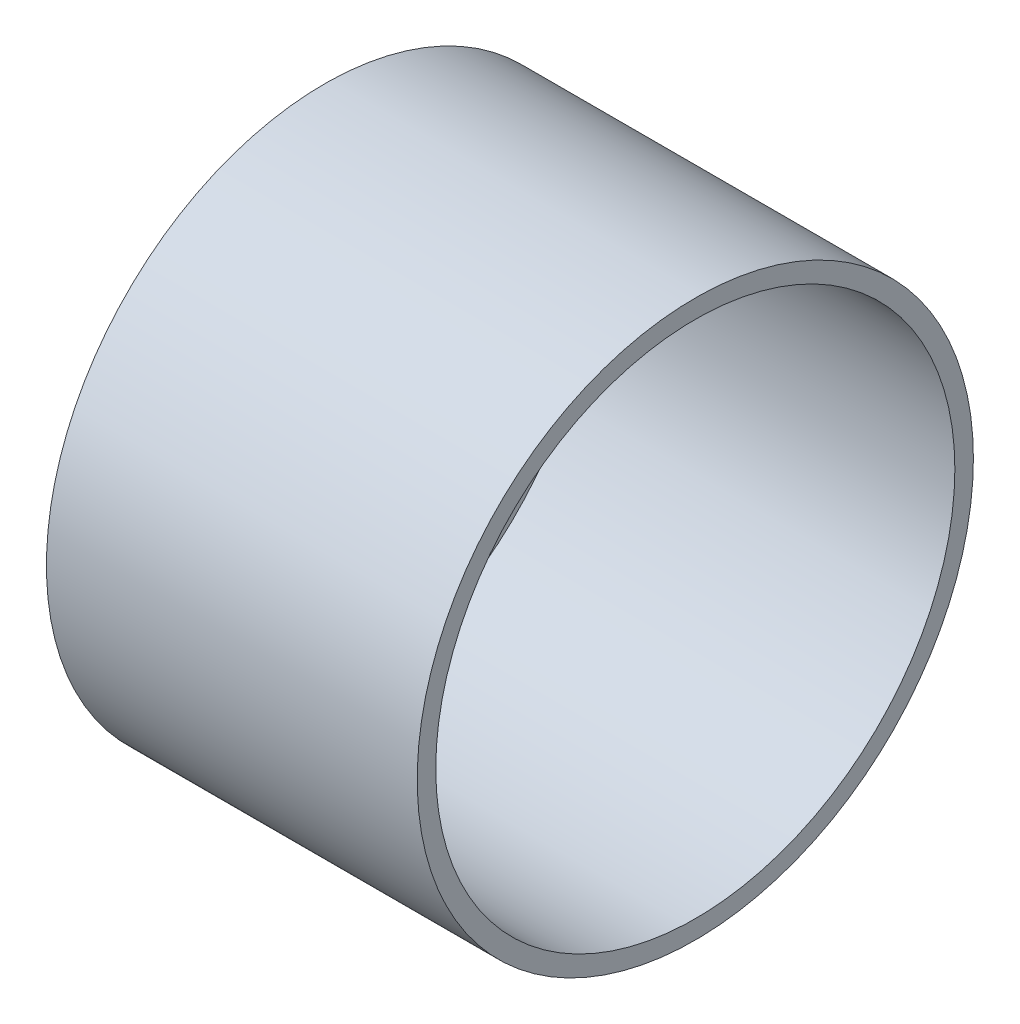
ISO-10303-21;
HEADER;
FILE_DESCRIPTION(('STEP AP214'),'2;1');
FILE_NAME('part.step','',(''),(''),'','','');
FILE_SCHEMA(('AUTOMOTIVE_DESIGN { 1 0 10303 214 1 1 1 1 }'));
ENDSEC;
DATA;
#1=APPLICATION_CONTEXT('core data for automotive mechanical design processes');
#2=APPLICATION_PROTOCOL_DEFINITION('international standard','automotive_design',2000,#1);
#3=PRODUCT_CONTEXT('',#1,'mechanical');
#4=PRODUCT('Part','Part','',(#3));
#5=PRODUCT_RELATED_PRODUCT_CATEGORY('part','',(#4));
#6=PRODUCT_DEFINITION_FORMATION('','',#4);
#7=PRODUCT_DEFINITION_CONTEXT('part definition',#1,'design');
#8=PRODUCT_DEFINITION('design','',#6,#7);
#9=PRODUCT_DEFINITION_SHAPE('','',#8);
#10=(LENGTH_UNIT() NAMED_UNIT(*) SI_UNIT(.MILLI.,.METRE.));
#11=(NAMED_UNIT(*) PLANE_ANGLE_UNIT() SI_UNIT($,.RADIAN.));
#12=(NAMED_UNIT(*) SI_UNIT($,.STERADIAN.) SOLID_ANGLE_UNIT());
#13=UNCERTAINTY_MEASURE_WITH_UNIT(LENGTH_MEASURE(1.E-05),#10,'distance_accuracy_value','');
#14=(GEOMETRIC_REPRESENTATION_CONTEXT(3) GLOBAL_UNCERTAINTY_ASSIGNED_CONTEXT((#13)) GLOBAL_UNIT_ASSIGNED_CONTEXT((#10,
#11,#12)) REPRESENTATION_CONTEXT('',''));
#15=CARTESIAN_POINT('',(0.,0.,0.));
#16=DIRECTION('',(0.,0.,1.));
#17=DIRECTION('',(1.,0.,0.));
#18=AXIS2_PLACEMENT_3D('',#15,#16,#17);
#19=CARTESIAN_POINT('',(1.99999999999999,0.,0.));
#20=DIRECTION('',(1.,0.,0.));
#21=DIRECTION('',(0.,0.,-1.));
#22=AXIS2_PLACEMENT_3D('',#19,#20,#21);
#23=PLANE('',#22);
#24=CARTESIAN_POINT('',(1.99999999999999,0.,0.));
#25=DIRECTION('',(1.,0.,0.));
#26=DIRECTION('',(0.,0.,-1.));
#27=AXIS2_PLACEMENT_3D('',#24,#25,#26);
#28=CIRCLE('',#27,6.);
#29=CARTESIAN_POINT('',(1.99999999999999,0.,-6.));
#30=VERTEX_POINT('',#29);
#31=EDGE_CURVE('E92',#30,#30,#28,.T.);
#32=ORIENTED_EDGE('',*,*,#31,.F.);
#33=EDGE_LOOP('',(#32));
#34=FACE_BOUND('',#33,.T.);
#35=CARTESIAN_POINT('',(1.99999999999999,15.,0.));
#36=DIRECTION('',(1.,0.,0.));
#37=DIRECTION('',(0.,0.,-1.));
#38=AXIS2_PLACEMENT_3D('',#35,#36,#37);
#39=CIRCLE('',#38,1.8);
#40=CARTESIAN_POINT('',(1.99999999999999,15.,-1.8));
#41=VERTEX_POINT('',#40);
#42=EDGE_CURVE('E84',#41,#41,#39,.T.);
#43=ORIENTED_EDGE('',*,*,#42,.F.);
#44=EDGE_LOOP('',(#43));
#45=FACE_BOUND('',#44,.T.);
#46=CARTESIAN_POINT('',(1.99999999999999,-7.50000000000006,12.9903810567665));
#47=DIRECTION('',(1.,0.,0.));
#48=DIRECTION('',(0.,0.,-1.));
#49=AXIS2_PLACEMENT_3D('',#46,#47,#48);
#50=CIRCLE('',#49,1.8);
#51=CARTESIAN_POINT('',(1.99999999999999,-7.50000000000006,11.1903810567665));
#52=VERTEX_POINT('',#51);
#53=EDGE_CURVE('E76',#52,#52,#50,.T.);
#54=ORIENTED_EDGE('',*,*,#53,.F.);
#55=EDGE_LOOP('',(#54));
#56=FACE_BOUND('',#55,.T.);
#57=CARTESIAN_POINT('',(1.99999999999999,-7.50000000000006,-12.9903810567665));
#58=DIRECTION('',(1.,0.,0.));
#59=DIRECTION('',(0.,0.,-1.));
#60=AXIS2_PLACEMENT_3D('',#57,#58,#59);
#61=CIRCLE('',#60,1.8);
#62=CARTESIAN_POINT('',(1.99999999999999,-7.50000000000006,-14.7903810567665));
#63=VERTEX_POINT('',#62);
#64=EDGE_CURVE('E68',#63,#63,#61,.T.);
#65=ORIENTED_EDGE('',*,*,#64,.F.);
#66=EDGE_LOOP('',(#65));
#67=FACE_BOUND('',#66,.T.);
#68=CARTESIAN_POINT('',(1.99999999999999,0.,0.));
#69=DIRECTION('',(1.,0.,0.));
#70=DIRECTION('',(0.,0.,-1.));
#71=AXIS2_PLACEMENT_3D('',#68,#69,#70);
#72=CIRCLE('',#71,70.);
#73=CARTESIAN_POINT('',(1.99999999999999,0.,-70.));
#74=VERTEX_POINT('',#73);
#75=EDGE_CURVE('E10',#74,#74,#72,.F.);
#76=ORIENTED_EDGE('',*,*,#75,.F.);
#77=EDGE_LOOP('',(#76));
#78=FACE_BOUND('',#77,.T.);
#79=ADVANCED_FACE('F43',(#34,#45,#56,#67,#78),#23,.T.);
#80=CARTESIAN_POINT('',(100.,0.,0.));
#81=DIRECTION('',(1.,0.,0.));
#82=DIRECTION('',(0.,0.,-1.));
#83=AXIS2_PLACEMENT_3D('',#80,#81,#82);
#84=PLANE('',#83);
#85=CARTESIAN_POINT('',(100.,0.,0.));
#86=DIRECTION('',(1.,0.,0.));
#87=DIRECTION('',(0.,0.,-1.));
#88=AXIS2_PLACEMENT_3D('',#85,#86,#87);
#89=CIRCLE('',#88,75.);
#90=CARTESIAN_POINT('',(100.,0.,-75.));
#91=VERTEX_POINT('',#90);
#92=EDGE_CURVE('E51',#91,#91,#89,.T.);
#93=ORIENTED_EDGE('',*,*,#92,.T.);
#94=EDGE_LOOP('',(#93));
#95=FACE_BOUND('',#94,.T.);
#96=CARTESIAN_POINT('',(100.,0.,0.));
#97=DIRECTION('',(1.,0.,0.));
#98=DIRECTION('',(0.,0.,-1.));
#99=AXIS2_PLACEMENT_3D('',#96,#97,#98);
#100=CIRCLE('',#99,70.);
#101=CARTESIAN_POINT('',(100.,0.,-70.));
#102=VERTEX_POINT('',#101);
#103=EDGE_CURVE('E62',#102,#102,#100,.T.);
#104=ORIENTED_EDGE('',*,*,#103,.F.);
#105=EDGE_LOOP('',(#104));
#106=FACE_BOUND('',#105,.T.);
#107=ADVANCED_FACE('F117',(#95,#106),#84,.T.);
#108=CARTESIAN_POINT('',(100.,0.,0.));
#109=DIRECTION('',(-1.,0.,0.));
#110=DIRECTION('',(0.,0.,1.));
#111=AXIS2_PLACEMENT_3D('',#108,#109,#110);
#112=CYLINDRICAL_SURFACE('',#111,75.);
#113=ORIENTED_EDGE('',*,*,#92,.F.);
#114=EDGE_LOOP('',(#113));
#115=FACE_BOUND('',#114,.T.);
#116=CARTESIAN_POINT('',(0.,0.,0.));
#117=DIRECTION('',(1.,0.,0.));
#118=DIRECTION('',(0.,0.,-1.));
#119=AXIS2_PLACEMENT_3D('',#116,#117,#118);
#120=CIRCLE('',#119,75.);
#121=CARTESIAN_POINT('',(0.,0.,-75.));
#122=VERTEX_POINT('',#121);
#123=EDGE_CURVE('E56',#122,#122,#120,.T.);
#124=ORIENTED_EDGE('',*,*,#123,.T.);
#125=EDGE_LOOP('',(#124));
#126=FACE_BOUND('',#125,.T.);
#127=ADVANCED_FACE('F115',(#115,#126),#112,.T.);
#128=CARTESIAN_POINT('',(100.,0.,0.));
#129=DIRECTION('',(-1.,0.,0.));
#130=DIRECTION('',(0.,0.,1.));
#131=AXIS2_PLACEMENT_3D('',#128,#129,#130);
#132=CYLINDRICAL_SURFACE('',#131,70.);
#133=ORIENTED_EDGE('',*,*,#75,.T.);
#134=EDGE_LOOP('',(#133));
#135=FACE_BOUND('',#134,.T.);
#136=ORIENTED_EDGE('',*,*,#103,.T.);
#137=EDGE_LOOP('',(#136));
#138=FACE_BOUND('',#137,.T.);
#139=ADVANCED_FACE('F106',(#135,#138),#132,.F.);
#140=CARTESIAN_POINT('',(0.,0.,0.));
#141=DIRECTION('',(1.,0.,0.));
#142=DIRECTION('',(0.,0.,-1.));
#143=AXIS2_PLACEMENT_3D('',#140,#141,#142);
#144=PLANE('',#143);
#145=CARTESIAN_POINT('',(0.,0.,0.));
#146=DIRECTION('',(1.,0.,0.));
#147=DIRECTION('',(0.,0.,-1.));
#148=AXIS2_PLACEMENT_3D('',#145,#146,#147);
#149=CIRCLE('',#148,6.);
#150=CARTESIAN_POINT('',(0.,0.,-6.));
#151=VERTEX_POINT('',#150);
#152=EDGE_CURVE('E88',#151,#151,#149,.F.);
#153=ORIENTED_EDGE('',*,*,#152,.F.);
#154=EDGE_LOOP('',(#153));
#155=FACE_BOUND('',#154,.T.);
#156=CARTESIAN_POINT('',(0.,15.,0.));
#157=DIRECTION('',(1.,0.,0.));
#158=DIRECTION('',(0.,0.,-1.));
#159=AXIS2_PLACEMENT_3D('',#156,#157,#158);
#160=CIRCLE('',#159,1.8);
#161=CARTESIAN_POINT('',(0.,15.,-1.8));
#162=VERTEX_POINT('',#161);
#163=EDGE_CURVE('E80',#162,#162,#160,.F.);
#164=ORIENTED_EDGE('',*,*,#163,.F.);
#165=EDGE_LOOP('',(#164));
#166=FACE_BOUND('',#165,.T.);
#167=CARTESIAN_POINT('',(0.,-7.50000000000006,12.9903810567665));
#168=DIRECTION('',(1.,0.,0.));
#169=DIRECTION('',(0.,0.,-1.));
#170=AXIS2_PLACEMENT_3D('',#167,#168,#169);
#171=CIRCLE('',#170,1.8);
#172=CARTESIAN_POINT('',(0.,-7.50000000000006,11.1903810567665));
#173=VERTEX_POINT('',#172);
#174=EDGE_CURVE('E72',#173,#173,#171,.F.);
#175=ORIENTED_EDGE('',*,*,#174,.F.);
#176=EDGE_LOOP('',(#175));
#177=FACE_BOUND('',#176,.T.);
#178=CARTESIAN_POINT('',(0.,-7.50000000000006,-12.9903810567665));
#179=DIRECTION('',(1.,0.,0.));
#180=DIRECTION('',(0.,0.,-1.));
#181=AXIS2_PLACEMENT_3D('',#178,#179,#180);
#182=CIRCLE('',#181,1.8);
#183=CARTESIAN_POINT('',(0.,-7.50000000000006,-14.7903810567665));
#184=VERTEX_POINT('',#183);
#185=EDGE_CURVE('E67',#184,#184,#182,.F.);
#186=ORIENTED_EDGE('',*,*,#185,.F.);
#187=EDGE_LOOP('',(#186));
#188=FACE_BOUND('',#187,.T.);
#189=ORIENTED_EDGE('',*,*,#123,.F.);
#190=EDGE_LOOP('',(#189));
#191=FACE_BOUND('',#190,.T.);
#192=ADVANCED_FACE('F45',(#155,#166,#177,#188,#191),#144,.F.);
#193=CARTESIAN_POINT('',(1.99999999999999,-7.50000000000006,-12.9903810567665));
#194=DIRECTION('',(1.,0.,0.));
#195=DIRECTION('',(0.,0.,-1.));
#196=AXIS2_PLACEMENT_3D('',#193,#194,#195);
#197=CYLINDRICAL_SURFACE('',#196,1.8);
#198=ORIENTED_EDGE('',*,*,#185,.T.);
#199=EDGE_LOOP('',(#198));
#200=FACE_BOUND('',#199,.T.);
#201=ORIENTED_EDGE('',*,*,#64,.T.);
#202=EDGE_LOOP('',(#201));
#203=FACE_BOUND('',#202,.T.);
#204=ADVANCED_FACE('F105',(#200,#203),#197,.F.);
#205=CARTESIAN_POINT('',(1.99999999999999,-7.50000000000006,12.9903810567665));
#206=DIRECTION('',(1.,0.,0.));
#207=DIRECTION('',(0.,0.,-1.));
#208=AXIS2_PLACEMENT_3D('',#205,#206,#207);
#209=CYLINDRICAL_SURFACE('',#208,1.8);
#210=ORIENTED_EDGE('',*,*,#174,.T.);
#211=EDGE_LOOP('',(#210));
#212=FACE_BOUND('',#211,.T.);
#213=ORIENTED_EDGE('',*,*,#53,.T.);
#214=EDGE_LOOP('',(#213));
#215=FACE_BOUND('',#214,.T.);
#216=ADVANCED_FACE('F141',(#212,#215),#209,.F.);
#217=CARTESIAN_POINT('',(1.99999999999999,15.,0.));
#218=DIRECTION('',(1.,0.,0.));
#219=DIRECTION('',(0.,0.,-1.));
#220=AXIS2_PLACEMENT_3D('',#217,#218,#219);
#221=CYLINDRICAL_SURFACE('',#220,1.8);
#222=ORIENTED_EDGE('',*,*,#163,.T.);
#223=EDGE_LOOP('',(#222));
#224=FACE_BOUND('',#223,.T.);
#225=ORIENTED_EDGE('',*,*,#42,.T.);
#226=EDGE_LOOP('',(#225));
#227=FACE_BOUND('',#226,.T.);
#228=ADVANCED_FACE('F147',(#224,#227),#221,.F.);
#229=CARTESIAN_POINT('',(1.99999999999999,0.,0.));
#230=DIRECTION('',(1.,0.,0.));
#231=DIRECTION('',(0.,0.,-1.));
#232=AXIS2_PLACEMENT_3D('',#229,#230,#231);
#233=CYLINDRICAL_SURFACE('',#232,6.);
#234=ORIENTED_EDGE('',*,*,#152,.T.);
#235=EDGE_LOOP('',(#234));
#236=FACE_BOUND('',#235,.T.);
#237=ORIENTED_EDGE('',*,*,#31,.T.);
#238=EDGE_LOOP('',(#237));
#239=FACE_BOUND('',#238,.T.);
#240=ADVANCED_FACE('F100',(#236,#239),#233,.F.);
#241=CLOSED_SHELL('',(#79,#107,#127,#139,#192,#204,#216,#228,#240));
#242=MANIFOLD_SOLID_BREP('B2',#241);
#243=ADVANCED_BREP_SHAPE_REPRESENTATION('',(#18,#242),#14);
#244=SHAPE_DEFINITION_REPRESENTATION(#9,#243);
ENDSEC;
END-ISO-10303-21;
